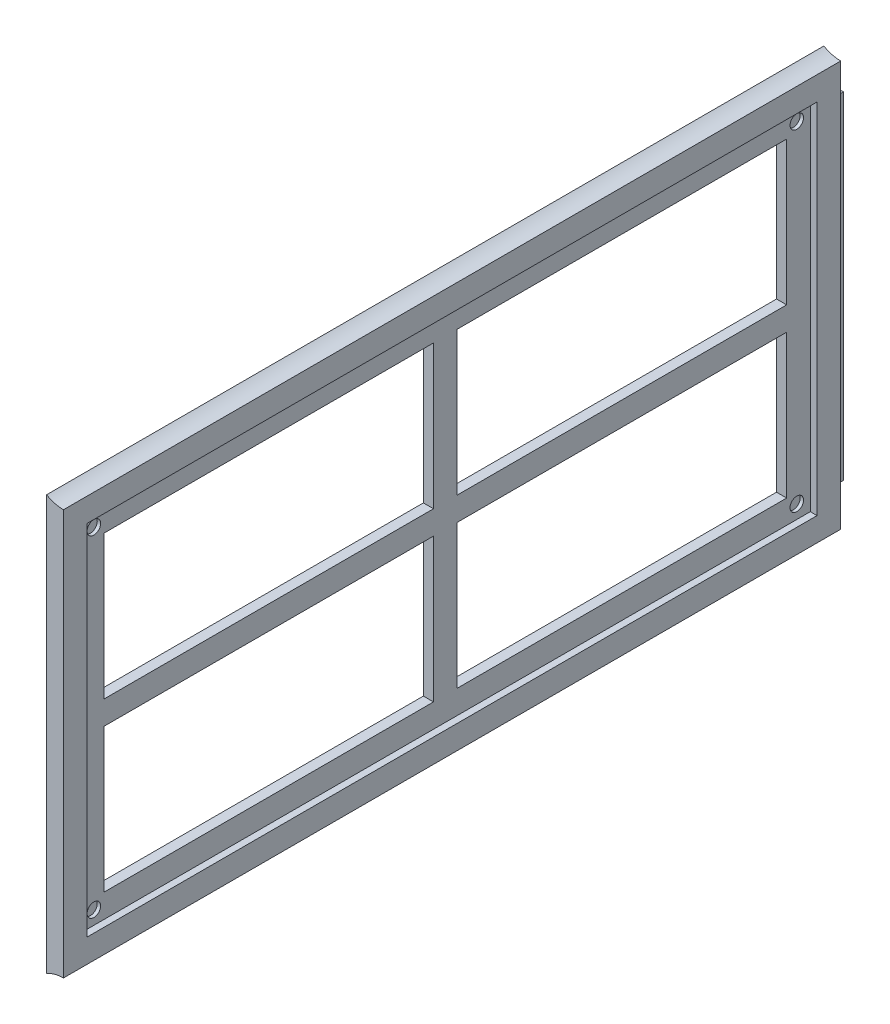
ISO-10303-21;
HEADER;
FILE_DESCRIPTION(('STEP AP214'),'2;1');
FILE_NAME('part.step','',(''),(''),'','','');
FILE_SCHEMA(('AUTOMOTIVE_DESIGN { 1 0 10303 214 1 1 1 1 }'));
ENDSEC;
DATA;
#1=APPLICATION_CONTEXT('core data for automotive mechanical design processes');
#2=APPLICATION_PROTOCOL_DEFINITION('international standard','automotive_design',2000,#1);
#3=PRODUCT_CONTEXT('',#1,'mechanical');
#4=PRODUCT('Part','Part','',(#3));
#5=PRODUCT_RELATED_PRODUCT_CATEGORY('part','',(#4));
#6=PRODUCT_DEFINITION_FORMATION('','',#4);
#7=PRODUCT_DEFINITION_CONTEXT('part definition',#1,'design');
#8=PRODUCT_DEFINITION('design','',#6,#7);
#9=PRODUCT_DEFINITION_SHAPE('','',#8);
#10=(LENGTH_UNIT() NAMED_UNIT(*) SI_UNIT(.MILLI.,.METRE.));
#11=(NAMED_UNIT(*) PLANE_ANGLE_UNIT() SI_UNIT($,.RADIAN.));
#12=(NAMED_UNIT(*) SI_UNIT($,.STERADIAN.) SOLID_ANGLE_UNIT());
#13=UNCERTAINTY_MEASURE_WITH_UNIT(LENGTH_MEASURE(1.E-05),#10,'distance_accuracy_value','');
#14=(GEOMETRIC_REPRESENTATION_CONTEXT(3) GLOBAL_UNCERTAINTY_ASSIGNED_CONTEXT((#13)) GLOBAL_UNIT_ASSIGNED_CONTEXT((#10,
#11,#12)) REPRESENTATION_CONTEXT('',''));
#15=CARTESIAN_POINT('',(0.,0.,0.));
#16=DIRECTION('',(0.,0.,1.));
#17=DIRECTION('',(1.,0.,0.));
#18=AXIS2_PLACEMENT_3D('',#15,#16,#17);
#19=CARTESIAN_POINT('',(-227.7,46.0020002000401,216.));
#20=DIRECTION('',(0.,0.,1.));
#21=DIRECTION('',(1.,0.,0.));
#22=AXIS2_PLACEMENT_3D('',#19,#20,#21);
#23=PLANE('',#22);
#24=DIRECTION('',(0.,1.,0.));
#25=VECTOR('',#24,1.);
#26=CARTESIAN_POINT('',(0.299999999999967,46.00200020004,216.));
#27=LINE('',#26,#25);
#28=CARTESIAN_POINT('',(0.299999999999967,3.50000000000001,216.));
#29=VERTEX_POINT('',#28);
#30=CARTESIAN_POINT('',(0.299999999999967,46.00200020004,216.));
#31=VERTEX_POINT('',#30);
#32=EDGE_CURVE('E326',#29,#31,#27,.T.);
#33=ORIENTED_EDGE('',*,*,#32,.F.);
#34=DIRECTION('',(1.,0.,0.));
#35=VECTOR('',#34,1.);
#36=CARTESIAN_POINT('',(-227.7,3.50000000000006,216.));
#37=LINE('',#36,#35);
#38=CARTESIAN_POINT('',(-2.70000000000004,3.50000000000001,216.));
#39=VERTEX_POINT('',#38);
#40=EDGE_CURVE('E350',#39,#29,#37,.T.);
#41=ORIENTED_EDGE('',*,*,#40,.F.);
#42=DIRECTION('',(0.,-1.,0.));
#43=VECTOR('',#42,1.);
#44=CARTESIAN_POINT('',(-2.70000000000003,-61.3397459621557,216.));
#45=LINE('',#44,#43);
#46=CARTESIAN_POINT('',(-2.70000000000004,46.0020002000401,216.));
#47=VERTEX_POINT('',#46);
#48=EDGE_CURVE('E405',#47,#39,#45,.T.);
#49=ORIENTED_EDGE('',*,*,#48,.F.);
#50=DIRECTION('',(1.,0.,0.));
#51=VECTOR('',#50,1.);
#52=CARTESIAN_POINT('',(-227.7,46.0020002000401,216.));
#53=LINE('',#52,#51);
#54=EDGE_CURVE('E378',#47,#31,#53,.T.);
#55=ORIENTED_EDGE('',*,*,#54,.T.);
#56=EDGE_LOOP('',(#33,#41,#49,#55));
#57=FACE_BOUND('',#56,.T.);
#58=ADVANCED_FACE('F45',(#57),#23,.F.);
#59=CARTESIAN_POINT('',(-227.7,46.0020002000401,216.));
#60=DIRECTION('',(0.,1.,0.));
#61=DIRECTION('',(-1.,0.,0.));
#62=AXIS2_PLACEMENT_3D('',#59,#60,#61);
#63=PLANE('',#62);
#64=DIRECTION('',(0.,0.,-1.));
#65=VECTOR('',#64,1.);
#66=CARTESIAN_POINT('',(0.299999999999967,46.00200020004,216.));
#67=LINE('',#66,#65);
#68=CARTESIAN_POINT('',(0.299999999999967,46.0020002000401,118.5));
#69=VERTEX_POINT('',#68);
#70=EDGE_CURVE('E323',#31,#69,#67,.T.);
#71=ORIENTED_EDGE('',*,*,#70,.F.);
#72=ORIENTED_EDGE('',*,*,#54,.F.);
#73=DIRECTION('',(0.,0.,1.));
#74=VECTOR('',#73,1.);
#75=CARTESIAN_POINT('',(-2.70000000000003,46.00200020004,230.));
#76=LINE('',#75,#74);
#77=CARTESIAN_POINT('',(-2.70000000000004,46.0020002000401,118.5));
#78=VERTEX_POINT('',#77);
#79=EDGE_CURVE('E401',#78,#47,#76,.T.);
#80=ORIENTED_EDGE('',*,*,#79,.F.);
#81=DIRECTION('',(1.,0.,0.));
#82=VECTOR('',#81,1.);
#83=CARTESIAN_POINT('',(-227.7,46.0020002000401,118.5));
#84=LINE('',#83,#82);
#85=EDGE_CURVE('E383',#78,#69,#84,.T.);
#86=ORIENTED_EDGE('',*,*,#85,.T.);
#87=EDGE_LOOP('',(#71,#72,#80,#86));
#88=FACE_BOUND('',#87,.T.);
#89=ADVANCED_FACE('F579',(#88),#63,.F.);
#90=CARTESIAN_POINT('',(-227.7,46.0020002000401,118.5));
#91=DIRECTION('',(0.,0.,-1.));
#92=DIRECTION('',(-1.,0.,0.));
#93=AXIS2_PLACEMENT_3D('',#90,#91,#92);
#94=PLANE('',#93);
#95=DIRECTION('',(0.,-1.,0.));
#96=VECTOR('',#95,1.);
#97=CARTESIAN_POINT('',(0.299999999999967,46.00200020004,118.5));
#98=LINE('',#97,#96);
#99=CARTESIAN_POINT('',(0.299999999999967,3.50000000000001,118.5));
#100=VERTEX_POINT('',#99);
#101=EDGE_CURVE('E69',#69,#100,#98,.T.);
#102=ORIENTED_EDGE('',*,*,#101,.F.);
#103=ORIENTED_EDGE('',*,*,#85,.F.);
#104=DIRECTION('',(0.,1.,0.));
#105=VECTOR('',#104,1.);
#106=CARTESIAN_POINT('',(-2.70000000000003,-61.3397459621557,118.5));
#107=LINE('',#106,#105);
#108=CARTESIAN_POINT('',(-2.70000000000003,3.5,118.5));
#109=VERTEX_POINT('',#108);
#110=EDGE_CURVE('E397',#109,#78,#107,.T.);
#111=ORIENTED_EDGE('',*,*,#110,.F.);
#112=DIRECTION('',(1.,0.,0.));
#113=VECTOR('',#112,1.);
#114=CARTESIAN_POINT('',(-227.7,3.50000000000006,118.5));
#115=LINE('',#114,#113);
#116=EDGE_CURVE('E387',#109,#100,#115,.T.);
#117=ORIENTED_EDGE('',*,*,#116,.T.);
#118=EDGE_LOOP('',(#102,#103,#111,#117));
#119=FACE_BOUND('',#118,.T.);
#120=ADVANCED_FACE('F586',(#119),#94,.F.);
#121=CARTESIAN_POINT('',(-227.7,3.50000000000006,216.));
#122=DIRECTION('',(0.,-1.,0.));
#123=DIRECTION('',(1.,0.,0.));
#124=AXIS2_PLACEMENT_3D('',#121,#122,#123);
#125=PLANE('',#124);
#126=DIRECTION('',(0.,0.,1.));
#127=VECTOR('',#126,1.);
#128=CARTESIAN_POINT('',(0.299999999999967,3.50000000000001,216.));
#129=LINE('',#128,#127);
#130=EDGE_CURVE('E318',#100,#29,#129,.T.);
#131=ORIENTED_EDGE('',*,*,#130,.F.);
#132=ORIENTED_EDGE('',*,*,#116,.F.);
#133=DIRECTION('',(0.,0.,-1.));
#134=VECTOR('',#133,1.);
#135=CARTESIAN_POINT('',(-2.70000000000003,3.5,230.));
#136=LINE('',#135,#134);
#137=EDGE_CURVE('E382',#39,#109,#136,.T.);
#138=ORIENTED_EDGE('',*,*,#137,.F.);
#139=ORIENTED_EDGE('',*,*,#40,.T.);
#140=EDGE_LOOP('',(#131,#132,#138,#139));
#141=FACE_BOUND('',#140,.T.);
#142=ADVANCED_FACE('F592',(#141),#125,.F.);
#143=CARTESIAN_POINT('',(-227.7,-3.49999999999994,14.));
#144=DIRECTION('',(0.,0.,-1.));
#145=DIRECTION('',(0.,1.,0.));
#146=AXIS2_PLACEMENT_3D('',#143,#144,#145);
#147=PLANE('',#146);
#148=DIRECTION('',(0.,-1.,0.));
#149=VECTOR('',#148,1.);
#150=CARTESIAN_POINT('',(0.299999999999967,-3.49999999999999,14.));
#151=LINE('',#150,#149);
#152=CARTESIAN_POINT('',(0.299999999999967,-3.49999999999999,14.));
#153=VERTEX_POINT('',#152);
#154=CARTESIAN_POINT('',(0.299999999999967,-46.00200020004,14.));
#155=VERTEX_POINT('',#154);
#156=EDGE_CURVE('E315',#153,#155,#151,.T.);
#157=ORIENTED_EDGE('',*,*,#156,.F.);
#158=DIRECTION('',(1.,0.,0.));
#159=VECTOR('',#158,1.);
#160=CARTESIAN_POINT('',(-227.7,-3.49999999999994,14.));
#161=LINE('',#160,#159);
#162=CARTESIAN_POINT('',(-2.70000000000004,-3.49999999999999,14.));
#163=VERTEX_POINT('',#162);
#164=EDGE_CURVE('E330',#163,#153,#161,.T.);
#165=ORIENTED_EDGE('',*,*,#164,.F.);
#166=DIRECTION('',(0.,1.,0.));
#167=VECTOR('',#166,1.);
#168=CARTESIAN_POINT('',(-2.70000000000003,-61.3397459621556,14.));
#169=LINE('',#168,#167);
#170=CARTESIAN_POINT('',(-2.70000000000004,-46.00200020004,14.));
#171=VERTEX_POINT('',#170);
#172=EDGE_CURVE('E421',#171,#163,#169,.T.);
#173=ORIENTED_EDGE('',*,*,#172,.F.);
#174=DIRECTION('',(1.,0.,0.));
#175=VECTOR('',#174,1.);
#176=CARTESIAN_POINT('',(-227.7,-46.00200020004,14.));
#177=LINE('',#176,#175);
#178=EDGE_CURVE('E329',#171,#155,#177,.T.);
#179=ORIENTED_EDGE('',*,*,#178,.T.);
#180=EDGE_LOOP('',(#157,#165,#173,#179));
#181=FACE_BOUND('',#180,.T.);
#182=ADVANCED_FACE('F784',(#181),#147,.F.);
#183=CARTESIAN_POINT('',(-227.7,-46.00200020004,14.));
#184=DIRECTION('',(0.,-1.,0.));
#185=DIRECTION('',(1.,0.,0.));
#186=AXIS2_PLACEMENT_3D('',#183,#184,#185);
#187=PLANE('',#186);
#188=DIRECTION('',(0.,0.,1.));
#189=VECTOR('',#188,1.);
#190=CARTESIAN_POINT('',(0.299999999999967,-46.00200020004,14.));
#191=LINE('',#190,#189);
#192=CARTESIAN_POINT('',(0.299999999999957,-46.00200020004,111.5));
#193=VERTEX_POINT('',#192);
#194=EDGE_CURVE('E312',#155,#193,#191,.T.);
#195=ORIENTED_EDGE('',*,*,#194,.F.);
#196=ORIENTED_EDGE('',*,*,#178,.F.);
#197=DIRECTION('',(0.,0.,-1.));
#198=VECTOR('',#197,1.);
#199=CARTESIAN_POINT('',(-2.70000000000003,-46.00200020004,230.));
#200=LINE('',#199,#198);
#201=CARTESIAN_POINT('',(-2.70000000000004,-46.00200020004,111.5));
#202=VERTEX_POINT('',#201);
#203=EDGE_CURVE('E417',#202,#171,#200,.T.);
#204=ORIENTED_EDGE('',*,*,#203,.F.);
#205=DIRECTION('',(1.,0.,0.));
#206=VECTOR('',#205,1.);
#207=CARTESIAN_POINT('',(-227.7,-46.00200020004,111.5));
#208=LINE('',#207,#206);
#209=EDGE_CURVE('E339',#202,#193,#208,.T.);
#210=ORIENTED_EDGE('',*,*,#209,.T.);
#211=EDGE_LOOP('',(#195,#196,#204,#210));
#212=FACE_BOUND('',#211,.T.);
#213=ADVANCED_FACE('F774',(#212),#187,.F.);
#214=CARTESIAN_POINT('',(-227.7,-3.49999999999994,111.5));
#215=DIRECTION('',(0.,0.,1.));
#216=DIRECTION('',(0.,-1.,0.));
#217=AXIS2_PLACEMENT_3D('',#214,#215,#216);
#218=PLANE('',#217);
#219=DIRECTION('',(0.,1.,0.));
#220=VECTOR('',#219,1.);
#221=CARTESIAN_POINT('',(0.299999999999967,-3.49999999999999,111.5));
#222=LINE('',#221,#220);
#223=CARTESIAN_POINT('',(0.299999999999967,-3.49999999999999,111.5));
#224=VERTEX_POINT('',#223);
#225=EDGE_CURVE('E309',#193,#224,#222,.T.);
#226=ORIENTED_EDGE('',*,*,#225,.F.);
#227=ORIENTED_EDGE('',*,*,#209,.F.);
#228=DIRECTION('',(0.,-1.,0.));
#229=VECTOR('',#228,1.);
#230=CARTESIAN_POINT('',(-2.70000000000003,-61.3397459621555,111.5));
#231=LINE('',#230,#229);
#232=CARTESIAN_POINT('',(-2.70000000000003,-3.49999999999999,111.5));
#233=VERTEX_POINT('',#232);
#234=EDGE_CURVE('E413',#233,#202,#231,.T.);
#235=ORIENTED_EDGE('',*,*,#234,.F.);
#236=DIRECTION('',(1.,0.,0.));
#237=VECTOR('',#236,1.);
#238=CARTESIAN_POINT('',(-227.7,-3.49999999999994,111.5));
#239=LINE('',#238,#237);
#240=EDGE_CURVE('E335',#233,#224,#239,.T.);
#241=ORIENTED_EDGE('',*,*,#240,.T.);
#242=EDGE_LOOP('',(#226,#227,#235,#241));
#243=FACE_BOUND('',#242,.T.);
#244=ADVANCED_FACE('F764',(#243),#218,.F.);
#245=CARTESIAN_POINT('',(-227.7,-3.49999999999994,14.));
#246=DIRECTION('',(0.,1.,0.));
#247=DIRECTION('',(-1.,0.,0.));
#248=AXIS2_PLACEMENT_3D('',#245,#246,#247);
#249=PLANE('',#248);
#250=DIRECTION('',(0.,0.,-1.));
#251=VECTOR('',#250,1.);
#252=CARTESIAN_POINT('',(0.299999999999967,-3.49999999999999,14.));
#253=LINE('',#252,#251);
#254=EDGE_CURVE('E306',#224,#153,#253,.T.);
#255=ORIENTED_EDGE('',*,*,#254,.F.);
#256=ORIENTED_EDGE('',*,*,#240,.F.);
#257=DIRECTION('',(0.,0.,1.));
#258=VECTOR('',#257,1.);
#259=CARTESIAN_POINT('',(-2.70000000000003,-3.49999999999999,230.));
#260=LINE('',#259,#258);
#261=EDGE_CURVE('E409',#163,#233,#260,.T.);
#262=ORIENTED_EDGE('',*,*,#261,.F.);
#263=ORIENTED_EDGE('',*,*,#164,.T.);
#264=EDGE_LOOP('',(#255,#256,#262,#263));
#265=FACE_BOUND('',#264,.T.);
#266=ADVANCED_FACE('F754',(#265),#249,.F.);
#267=CARTESIAN_POINT('',(-227.7,-3.49999999999994,216.));
#268=DIRECTION('',(0.,0.,1.));
#269=DIRECTION('',(1.,0.,0.));
#270=AXIS2_PLACEMENT_3D('',#267,#268,#269);
#271=PLANE('',#270);
#272=DIRECTION('',(0.,1.,0.));
#273=VECTOR('',#272,1.);
#274=CARTESIAN_POINT('',(0.299999999999967,-3.49999999999999,216.));
#275=LINE('',#274,#273);
#276=CARTESIAN_POINT('',(0.299999999999967,-46.00200020004,216.));
#277=VERTEX_POINT('',#276);
#278=CARTESIAN_POINT('',(0.299999999999967,-3.49999999999999,216.));
#279=VERTEX_POINT('',#278);
#280=EDGE_CURVE('E303',#277,#279,#275,.T.);
#281=ORIENTED_EDGE('',*,*,#280,.F.);
#282=DIRECTION('',(1.,0.,0.));
#283=VECTOR('',#282,1.);
#284=CARTESIAN_POINT('',(-227.7,-46.0020002000399,216.));
#285=LINE('',#284,#283);
#286=CARTESIAN_POINT('',(-2.70000000000004,-46.00200020004,216.));
#287=VERTEX_POINT('',#286);
#288=EDGE_CURVE('E363',#287,#277,#285,.T.);
#289=ORIENTED_EDGE('',*,*,#288,.F.);
#290=DIRECTION('',(0.,-1.,0.));
#291=VECTOR('',#290,1.);
#292=CARTESIAN_POINT('',(-2.70000000000003,-61.3397459621557,216.));
#293=LINE('',#292,#291);
#294=CARTESIAN_POINT('',(-2.70000000000004,-3.49999999999999,216.));
#295=VERTEX_POINT('',#294);
#296=EDGE_CURVE('E437',#295,#287,#293,.T.);
#297=ORIENTED_EDGE('',*,*,#296,.F.);
#298=DIRECTION('',(1.,0.,0.));
#299=VECTOR('',#298,1.);
#300=CARTESIAN_POINT('',(-227.7,-3.49999999999994,216.));
#301=LINE('',#300,#299);
#302=EDGE_CURVE('E334',#295,#279,#301,.T.);
#303=ORIENTED_EDGE('',*,*,#302,.T.);
#304=EDGE_LOOP('',(#281,#289,#297,#303));
#305=FACE_BOUND('',#304,.T.);
#306=ADVANCED_FACE('F744',(#305),#271,.F.);
#307=CARTESIAN_POINT('',(-227.7,-3.49999999999994,216.));
#308=DIRECTION('',(0.,1.,0.));
#309=DIRECTION('',(-1.,0.,0.));
#310=AXIS2_PLACEMENT_3D('',#307,#308,#309);
#311=PLANE('',#310);
#312=DIRECTION('',(0.,0.,-1.));
#313=VECTOR('',#312,1.);
#314=CARTESIAN_POINT('',(0.299999999999967,-3.49999999999999,216.));
#315=LINE('',#314,#313);
#316=CARTESIAN_POINT('',(0.299999999999967,-3.49999999999999,118.5));
#317=VERTEX_POINT('',#316);
#318=EDGE_CURVE('E300',#279,#317,#315,.T.);
#319=ORIENTED_EDGE('',*,*,#318,.F.);
#320=ORIENTED_EDGE('',*,*,#302,.F.);
#321=DIRECTION('',(0.,0.,1.));
#322=VECTOR('',#321,1.);
#323=CARTESIAN_POINT('',(-2.70000000000003,-3.49999999999999,230.));
#324=LINE('',#323,#322);
#325=CARTESIAN_POINT('',(-2.70000000000004,-3.49999999999999,118.5));
#326=VERTEX_POINT('',#325);
#327=EDGE_CURVE('E433',#326,#295,#324,.T.);
#328=ORIENTED_EDGE('',*,*,#327,.F.);
#329=DIRECTION('',(1.,0.,0.));
#330=VECTOR('',#329,1.);
#331=CARTESIAN_POINT('',(-227.7,-3.49999999999994,118.5));
#332=LINE('',#331,#330);
#333=EDGE_CURVE('E371',#326,#317,#332,.T.);
#334=ORIENTED_EDGE('',*,*,#333,.T.);
#335=EDGE_LOOP('',(#319,#320,#328,#334));
#336=FACE_BOUND('',#335,.T.);
#337=ADVANCED_FACE('F734',(#336),#311,.F.);
#338=CARTESIAN_POINT('',(-227.7,-3.49999999999994,118.5));
#339=DIRECTION('',(0.,0.,-1.));
#340=DIRECTION('',(0.,1.,0.));
#341=AXIS2_PLACEMENT_3D('',#338,#339,#340);
#342=PLANE('',#341);
#343=DIRECTION('',(0.,-1.,0.));
#344=VECTOR('',#343,1.);
#345=CARTESIAN_POINT('',(0.299999999999967,-3.49999999999999,118.5));
#346=LINE('',#345,#344);
#347=CARTESIAN_POINT('',(0.299999999999967,-46.00200020004,118.5));
#348=VERTEX_POINT('',#347);
#349=EDGE_CURVE('E297',#317,#348,#346,.T.);
#350=ORIENTED_EDGE('',*,*,#349,.F.);
#351=ORIENTED_EDGE('',*,*,#333,.F.);
#352=DIRECTION('',(0.,1.,0.));
#353=VECTOR('',#352,1.);
#354=CARTESIAN_POINT('',(-2.70000000000003,-61.3397459621556,118.5));
#355=LINE('',#354,#353);
#356=CARTESIAN_POINT('',(-2.70000000000003,-46.00200020004,118.5));
#357=VERTEX_POINT('',#356);
#358=EDGE_CURVE('E429',#357,#326,#355,.T.);
#359=ORIENTED_EDGE('',*,*,#358,.F.);
#360=DIRECTION('',(1.,0.,0.));
#361=VECTOR('',#360,1.);
#362=CARTESIAN_POINT('',(-227.7,-46.0020002000399,118.5));
#363=LINE('',#362,#361);
#364=EDGE_CURVE('E367',#357,#348,#363,.T.);
#365=ORIENTED_EDGE('',*,*,#364,.T.);
#366=EDGE_LOOP('',(#350,#351,#359,#365));
#367=FACE_BOUND('',#366,.T.);
#368=ADVANCED_FACE('F724',(#367),#342,.F.);
#369=CARTESIAN_POINT('',(-227.7,-46.0020002000399,216.));
#370=DIRECTION('',(0.,-1.,0.));
#371=DIRECTION('',(1.,0.,0.));
#372=AXIS2_PLACEMENT_3D('',#369,#370,#371);
#373=PLANE('',#372);
#374=DIRECTION('',(0.,0.,1.));
#375=VECTOR('',#374,1.);
#376=CARTESIAN_POINT('',(0.299999999999967,-46.00200020004,216.));
#377=LINE('',#376,#375);
#378=EDGE_CURVE('E294',#348,#277,#377,.T.);
#379=ORIENTED_EDGE('',*,*,#378,.F.);
#380=ORIENTED_EDGE('',*,*,#364,.F.);
#381=DIRECTION('',(0.,0.,-1.));
#382=VECTOR('',#381,1.);
#383=CARTESIAN_POINT('',(-2.70000000000003,-46.00200020004,230.));
#384=LINE('',#383,#382);
#385=EDGE_CURVE('E425',#287,#357,#384,.T.);
#386=ORIENTED_EDGE('',*,*,#385,.F.);
#387=ORIENTED_EDGE('',*,*,#288,.T.);
#388=EDGE_LOOP('',(#379,#380,#386,#387));
#389=FACE_BOUND('',#388,.T.);
#390=ADVANCED_FACE('F714',(#389),#373,.F.);
#391=CARTESIAN_POINT('',(-227.7,46.0020002000402,111.5));
#392=DIRECTION('',(0.,0.,1.));
#393=DIRECTION('',(0.,-1.,0.));
#394=AXIS2_PLACEMENT_3D('',#391,#392,#393);
#395=PLANE('',#394);
#396=DIRECTION('',(0.,1.,0.));
#397=VECTOR('',#396,1.);
#398=CARTESIAN_POINT('',(0.299999999999967,46.0020002000401,111.5));
#399=LINE('',#398,#397);
#400=CARTESIAN_POINT('',(0.299999999999967,3.50000000000001,111.5));
#401=VERTEX_POINT('',#400);
#402=CARTESIAN_POINT('',(0.299999999999967,46.0020002000401,111.5));
#403=VERTEX_POINT('',#402);
#404=EDGE_CURVE('E291',#401,#403,#399,.T.);
#405=ORIENTED_EDGE('',*,*,#404,.F.);
#406=DIRECTION('',(1.,0.,0.));
#407=VECTOR('',#406,1.);
#408=CARTESIAN_POINT('',(-227.7,3.50000000000006,111.5));
#409=LINE('',#408,#407);
#410=CARTESIAN_POINT('',(-2.70000000000004,3.50000000000001,111.5));
#411=VERTEX_POINT('',#410);
#412=EDGE_CURVE('E346',#411,#401,#409,.T.);
#413=ORIENTED_EDGE('',*,*,#412,.F.);
#414=DIRECTION('',(0.,-1.,0.));
#415=VECTOR('',#414,1.);
#416=CARTESIAN_POINT('',(-2.70000000000003,-61.3397459621557,111.5));
#417=LINE('',#416,#415);
#418=CARTESIAN_POINT('',(-2.70000000000004,46.0020002000401,111.5));
#419=VERTEX_POINT('',#418);
#420=EDGE_CURVE('E453',#419,#411,#417,.T.);
#421=ORIENTED_EDGE('',*,*,#420,.F.);
#422=DIRECTION('',(1.,0.,0.));
#423=VECTOR('',#422,1.);
#424=CARTESIAN_POINT('',(-227.7,46.0020002000402,111.5));
#425=LINE('',#424,#423);
#426=EDGE_CURVE('E359',#419,#403,#425,.T.);
#427=ORIENTED_EDGE('',*,*,#426,.T.);
#428=EDGE_LOOP('',(#405,#413,#421,#427));
#429=FACE_BOUND('',#428,.T.);
#430=ADVANCED_FACE('F704',(#429),#395,.F.);
#431=CARTESIAN_POINT('',(-227.7,46.0020002000402,111.5));
#432=DIRECTION('',(0.,1.,0.));
#433=DIRECTION('',(-1.,0.,0.));
#434=AXIS2_PLACEMENT_3D('',#431,#432,#433);
#435=PLANE('',#434);
#436=DIRECTION('',(0.,0.,-1.));
#437=VECTOR('',#436,1.);
#438=CARTESIAN_POINT('',(0.299999999999967,46.0020002000401,111.5));
#439=LINE('',#438,#437);
#440=CARTESIAN_POINT('',(0.299999999999967,46.0020002000401,14.));
#441=VERTEX_POINT('',#440);
#442=EDGE_CURVE('E288',#403,#441,#439,.T.);
#443=ORIENTED_EDGE('',*,*,#442,.F.);
#444=ORIENTED_EDGE('',*,*,#426,.F.);
#445=DIRECTION('',(0.,0.,1.));
#446=VECTOR('',#445,1.);
#447=CARTESIAN_POINT('',(-2.70000000000003,46.0020002000401,230.));
#448=LINE('',#447,#446);
#449=CARTESIAN_POINT('',(-2.70000000000004,46.0020002000401,14.));
#450=VERTEX_POINT('',#449);
#451=EDGE_CURVE('E449',#450,#419,#448,.T.);
#452=ORIENTED_EDGE('',*,*,#451,.F.);
#453=DIRECTION('',(1.,0.,0.));
#454=VECTOR('',#453,1.);
#455=CARTESIAN_POINT('',(-227.7,46.0020002000402,14.));
#456=LINE('',#455,#454);
#457=EDGE_CURVE('E355',#450,#441,#456,.T.);
#458=ORIENTED_EDGE('',*,*,#457,.T.);
#459=EDGE_LOOP('',(#443,#444,#452,#458));
#460=FACE_BOUND('',#459,.T.);
#461=ADVANCED_FACE('F694',(#460),#435,.F.);
#462=CARTESIAN_POINT('',(-227.7,46.0020002000402,14.));
#463=DIRECTION('',(0.,0.,-1.));
#464=DIRECTION('',(0.,1.,0.));
#465=AXIS2_PLACEMENT_3D('',#462,#463,#464);
#466=PLANE('',#465);
#467=DIRECTION('',(0.,-1.,0.));
#468=VECTOR('',#467,1.);
#469=CARTESIAN_POINT('',(0.299999999999967,46.0020002000401,14.));
#470=LINE('',#469,#468);
#471=CARTESIAN_POINT('',(0.299999999999967,3.50000000000001,14.));
#472=VERTEX_POINT('',#471);
#473=EDGE_CURVE('E280',#441,#472,#470,.T.);
#474=ORIENTED_EDGE('',*,*,#473,.F.);
#475=ORIENTED_EDGE('',*,*,#457,.F.);
#476=DIRECTION('',(0.,1.,0.));
#477=VECTOR('',#476,1.);
#478=CARTESIAN_POINT('',(-2.70000000000003,-61.3397459621556,14.));
#479=LINE('',#478,#477);
#480=CARTESIAN_POINT('',(-2.70000000000003,3.5,14.));
#481=VERTEX_POINT('',#480);
#482=EDGE_CURVE('E445',#481,#450,#479,.T.);
#483=ORIENTED_EDGE('',*,*,#482,.F.);
#484=DIRECTION('',(1.,0.,0.));
#485=VECTOR('',#484,1.);
#486=CARTESIAN_POINT('',(-227.7,3.50000000000006,14.));
#487=LINE('',#486,#485);
#488=EDGE_CURVE('E351',#481,#472,#487,.T.);
#489=ORIENTED_EDGE('',*,*,#488,.T.);
#490=EDGE_LOOP('',(#474,#475,#483,#489));
#491=FACE_BOUND('',#490,.T.);
#492=ADVANCED_FACE('F574',(#491),#466,.F.);
#493=CARTESIAN_POINT('',(-227.7,3.50000000000006,111.5));
#494=DIRECTION('',(0.,-1.,0.));
#495=DIRECTION('',(1.,0.,0.));
#496=AXIS2_PLACEMENT_3D('',#493,#494,#495);
#497=PLANE('',#496);
#498=DIRECTION('',(0.,0.,1.));
#499=VECTOR('',#498,1.);
#500=CARTESIAN_POINT('',(0.299999999999967,3.50000000000001,111.5));
#501=LINE('',#500,#499);
#502=EDGE_CURVE('E11',#472,#401,#501,.T.);
#503=ORIENTED_EDGE('',*,*,#502,.F.);
#504=ORIENTED_EDGE('',*,*,#488,.F.);
#505=DIRECTION('',(0.,0.,-1.));
#506=VECTOR('',#505,1.);
#507=CARTESIAN_POINT('',(-2.70000000000003,3.5,230.));
#508=LINE('',#507,#506);
#509=EDGE_CURVE('E441',#411,#481,#508,.T.);
#510=ORIENTED_EDGE('',*,*,#509,.F.);
#511=ORIENTED_EDGE('',*,*,#412,.T.);
#512=EDGE_LOOP('',(#503,#504,#510,#511));
#513=FACE_BOUND('',#512,.T.);
#514=ADVANCED_FACE('F566',(#513),#497,.F.);
#515=CARTESIAN_POINT('',(2.29653499121186,70.0019995997259,230.));
#516=DIRECTION('',(0.,0.,1.));
#517=DIRECTION('',(1.,0.,0.));
#518=AXIS2_PLACEMENT_3D('',#515,#516,#517);
#519=PLANE('',#518);
#520=CARTESIAN_POINT('',(2.29653499121186,70.0019995997259,230.));
#521=DIRECTION('',(0.,0.,-1.));
#522=DIRECTION('',(1.,0.,0.));
#523=AXIS2_PLACEMENT_3D('',#520,#521,#522);
#524=CIRCLE('',#523,10.0000000000001);
#525=CARTESIAN_POINT('',(2.29999999999997,60.00200020004,230.));
#526=VERTEX_POINT('',#525);
#527=CARTESIAN_POINT('',(-2.70000000000003,61.3397459621557,230.));
#528=VERTEX_POINT('',#527);
#529=EDGE_CURVE('E505',#526,#528,#524,.T.);
#530=ORIENTED_EDGE('',*,*,#529,.T.);
#531=DIRECTION('',(0.,-1.,0.));
#532=VECTOR('',#531,1.);
#533=CARTESIAN_POINT('',(-2.70000000000003,-61.3397459621557,230.));
#534=LINE('',#533,#532);
#535=CARTESIAN_POINT('',(-2.70000000000003,-61.3397459621557,230.));
#536=VERTEX_POINT('',#535);
#537=EDGE_CURVE('E509',#528,#536,#534,.T.);
#538=ORIENTED_EDGE('',*,*,#537,.T.);
#539=CARTESIAN_POINT('',(2.29653499121182,-70.0019995997256,230.));
#540=DIRECTION('',(0.,0.,-1.));
#541=DIRECTION('',(-1.,0.,0.));
#542=AXIS2_PLACEMENT_3D('',#539,#540,#541);
#543=CIRCLE('',#542,9.99999999999993);
#544=CARTESIAN_POINT('',(2.29999999999998,-60.00200020004,230.));
#545=VERTEX_POINT('',#544);
#546=EDGE_CURVE('E513',#536,#545,#543,.T.);
#547=ORIENTED_EDGE('',*,*,#546,.T.);
#548=DIRECTION('',(0.,1.,0.));
#549=VECTOR('',#548,1.);
#550=CARTESIAN_POINT('',(2.29999999999997,60.00200020004,230.));
#551=LINE('',#550,#549);
#552=EDGE_CURVE('E516',#545,#526,#551,.T.);
#553=ORIENTED_EDGE('',*,*,#552,.T.);
#554=EDGE_LOOP('',(#530,#538,#547,#553));
#555=FACE_BOUND('',#554,.T.);
#556=ADVANCED_FACE('F564',(#555),#519,.T.);
#557=CARTESIAN_POINT('',(2.29653499121186,70.0019995997259,0.));
#558=DIRECTION('',(0.,0.,1.));
#559=DIRECTION('',(1.,0.,0.));
#560=AXIS2_PLACEMENT_3D('',#557,#558,#559);
#561=PLANE('',#560);
#562=CARTESIAN_POINT('',(2.29653499121186,70.0019995997259,0.));
#563=DIRECTION('',(0.,0.,-1.));
#564=DIRECTION('',(1.,0.,0.));
#565=AXIS2_PLACEMENT_3D('',#562,#563,#564);
#566=CIRCLE('',#565,10.0000000000001);
#567=CARTESIAN_POINT('',(2.29999999999997,60.00200020004,0.));
#568=VERTEX_POINT('',#567);
#569=CARTESIAN_POINT('',(-2.70000000000003,61.3397459621557,0.));
#570=VERTEX_POINT('',#569);
#571=EDGE_CURVE('E504',#568,#570,#566,.T.);
#572=ORIENTED_EDGE('',*,*,#571,.F.);
#573=DIRECTION('',(0.,1.,0.));
#574=VECTOR('',#573,1.);
#575=CARTESIAN_POINT('',(2.29999999999997,60.00200020004,0.));
#576=LINE('',#575,#574);
#577=CARTESIAN_POINT('',(2.29999999999998,-60.00200020004,0.));
#578=VERTEX_POINT('',#577);
#579=EDGE_CURVE('E510',#578,#568,#576,.T.);
#580=ORIENTED_EDGE('',*,*,#579,.F.);
#581=CARTESIAN_POINT('',(2.29653499121182,-70.0019995997256,0.));
#582=DIRECTION('',(0.,0.,-1.));
#583=DIRECTION('',(-1.,0.,0.));
#584=AXIS2_PLACEMENT_3D('',#581,#582,#583);
#585=CIRCLE('',#584,9.99999999999993);
#586=CARTESIAN_POINT('',(-2.70000000000003,-61.3397459621557,0.));
#587=VERTEX_POINT('',#586);
#588=EDGE_CURVE('E526',#587,#578,#585,.T.);
#589=ORIENTED_EDGE('',*,*,#588,.F.);
#590=DIRECTION('',(0.,-1.,0.));
#591=VECTOR('',#590,1.);
#592=CARTESIAN_POINT('',(-2.70000000000003,-61.3397459621557,0.));
#593=LINE('',#592,#591);
#594=EDGE_CURVE('E523',#570,#587,#593,.T.);
#595=ORIENTED_EDGE('',*,*,#594,.F.);
#596=EDGE_LOOP('',(#572,#580,#589,#595));
#597=FACE_BOUND('',#596,.T.);
#598=DIRECTION('',(0.,-1.,0.));
#599=VECTOR('',#598,1.);
#600=CARTESIAN_POINT('',(-1.00000000000003,50.,0.));
#601=LINE('',#600,#599);
#602=CARTESIAN_POINT('',(-1.00000000000003,50.,0.));
#603=VERTEX_POINT('',#602);
#604=CARTESIAN_POINT('',(-1.00000000000002,-49.6,0.));
#605=VERTEX_POINT('',#604);
#606=EDGE_CURVE('E478',#603,#605,#601,.T.);
#607=ORIENTED_EDGE('',*,*,#606,.T.);
#608=DIRECTION('',(1.,0.,0.));
#609=VECTOR('',#608,1.);
#610=CARTESIAN_POINT('',(-1.00000000000003,-49.6,0.));
#611=LINE('',#610,#609);
#612=CARTESIAN_POINT('',(0.599999999999972,-49.6,0.));
#613=VERTEX_POINT('',#612);
#614=EDGE_CURVE('E492',#605,#613,#611,.T.);
#615=ORIENTED_EDGE('',*,*,#614,.T.);
#616=DIRECTION('',(0.,1.,0.));
#617=VECTOR('',#616,1.);
#618=CARTESIAN_POINT('',(0.599999999999959,50.,0.));
#619=LINE('',#618,#617);
#620=CARTESIAN_POINT('',(0.599999999999959,50.,0.));
#621=VERTEX_POINT('',#620);
#622=EDGE_CURVE('E496',#613,#621,#619,.T.);
#623=ORIENTED_EDGE('',*,*,#622,.T.);
#624=DIRECTION('',(-1.,0.,0.));
#625=VECTOR('',#624,1.);
#626=CARTESIAN_POINT('',(-1.00000000000003,50.,0.));
#627=LINE('',#626,#625);
#628=EDGE_CURVE('E500',#621,#603,#627,.T.);
#629=ORIENTED_EDGE('',*,*,#628,.T.);
#630=EDGE_LOOP('',(#607,#615,#623,#629));
#631=FACE_BOUND('',#630,.T.);
#632=ADVANCED_FACE('F553',(#597,#631),#561,.F.);
#633=CARTESIAN_POINT('',(2.29653499121186,70.0019995997259,230.));
#634=DIRECTION('',(0.,0.,-1.));
#635=DIRECTION('',(-1.,0.,0.));
#636=AXIS2_PLACEMENT_3D('',#633,#634,#635);
#637=CYLINDRICAL_SURFACE('',#636,10.0000000000001);
#638=ORIENTED_EDGE('',*,*,#571,.T.);
#639=DIRECTION('',(0.,0.,-1.));
#640=VECTOR('',#639,1.);
#641=CARTESIAN_POINT('',(-2.70000000000003,61.3397459621557,230.));
#642=LINE('',#641,#640);
#643=EDGE_CURVE('E54',#528,#570,#642,.T.);
#644=ORIENTED_EDGE('',*,*,#643,.F.);
#645=ORIENTED_EDGE('',*,*,#529,.F.);
#646=DIRECTION('',(0.,0.,-1.));
#647=VECTOR('',#646,1.);
#648=CARTESIAN_POINT('',(2.29999999999997,60.00200020004,230.));
#649=LINE('',#648,#647);
#650=EDGE_CURVE('E519',#526,#568,#649,.T.);
#651=ORIENTED_EDGE('',*,*,#650,.T.);
#652=EDGE_LOOP('',(#638,#644,#645,#651));
#653=FACE_BOUND('',#652,.T.);
#654=ADVANCED_FACE('F47',(#653),#637,.F.);
#655=CARTESIAN_POINT('',(-2.70000000000003,-61.3397459621557,230.));
#656=DIRECTION('',(1.,0.,0.));
#657=DIRECTION('',(0.,1.,0.));
#658=AXIS2_PLACEMENT_3D('',#655,#656,#657);
#659=PLANE('',#658);
#660=ORIENTED_EDGE('',*,*,#451,.T.);
#661=ORIENTED_EDGE('',*,*,#420,.T.);
#662=ORIENTED_EDGE('',*,*,#509,.T.);
#663=ORIENTED_EDGE('',*,*,#482,.T.);
#664=EDGE_LOOP('',(#660,#661,#662,#663));
#665=FACE_BOUND('',#664,.T.);
#666=ORIENTED_EDGE('',*,*,#327,.T.);
#667=ORIENTED_EDGE('',*,*,#296,.T.);
#668=ORIENTED_EDGE('',*,*,#385,.T.);
#669=ORIENTED_EDGE('',*,*,#358,.T.);
#670=EDGE_LOOP('',(#666,#667,#668,#669));
#671=FACE_BOUND('',#670,.T.);
#672=ORIENTED_EDGE('',*,*,#203,.T.);
#673=ORIENTED_EDGE('',*,*,#172,.T.);
#674=ORIENTED_EDGE('',*,*,#261,.T.);
#675=ORIENTED_EDGE('',*,*,#234,.T.);
#676=EDGE_LOOP('',(#672,#673,#674,#675));
#677=FACE_BOUND('',#676,.T.);
#678=ORIENTED_EDGE('',*,*,#79,.T.);
#679=ORIENTED_EDGE('',*,*,#48,.T.);
#680=ORIENTED_EDGE('',*,*,#137,.T.);
#681=ORIENTED_EDGE('',*,*,#110,.T.);
#682=EDGE_LOOP('',(#678,#679,#680,#681));
#683=FACE_BOUND('',#682,.T.);
#684=ORIENTED_EDGE('',*,*,#594,.T.);
#685=DIRECTION('',(0.,0.,-1.));
#686=VECTOR('',#685,1.);
#687=CARTESIAN_POINT('',(-2.70000000000003,-61.3397459621557,230.));
#688=LINE('',#687,#686);
#689=EDGE_CURVE('E538',#536,#587,#688,.T.);
#690=ORIENTED_EDGE('',*,*,#689,.F.);
#691=ORIENTED_EDGE('',*,*,#537,.F.);
#692=ORIENTED_EDGE('',*,*,#643,.T.);
#693=EDGE_LOOP('',(#684,#690,#691,#692));
#694=FACE_BOUND('',#693,.T.);
#695=ADVANCED_FACE('F545',(#665,#671,#677,#683,#694),#659,.F.);
#696=CARTESIAN_POINT('',(2.29653499121182,-70.0019995997256,230.));
#697=DIRECTION('',(0.,0.,-1.));
#698=DIRECTION('',(-1.,0.,0.));
#699=AXIS2_PLACEMENT_3D('',#696,#697,#698);
#700=CYLINDRICAL_SURFACE('',#699,9.99999999999993);
#701=ORIENTED_EDGE('',*,*,#588,.T.);
#702=DIRECTION('',(0.,0.,-1.));
#703=VECTOR('',#702,1.);
#704=CARTESIAN_POINT('',(2.29999999999998,-60.00200020004,230.));
#705=LINE('',#704,#703);
#706=EDGE_CURVE('E534',#545,#578,#705,.T.);
#707=ORIENTED_EDGE('',*,*,#706,.F.);
#708=ORIENTED_EDGE('',*,*,#546,.F.);
#709=ORIENTED_EDGE('',*,*,#689,.T.);
#710=EDGE_LOOP('',(#701,#707,#708,#709));
#711=FACE_BOUND('',#710,.T.);
#712=ADVANCED_FACE('F558',(#711),#700,.F.);
#713=CARTESIAN_POINT('',(2.29999999999997,60.00200020004,230.));
#714=DIRECTION('',(-1.,0.,0.));
#715=DIRECTION('',(0.,-1.,0.));
#716=AXIS2_PLACEMENT_3D('',#713,#714,#715);
#717=PLANE('',#716);
#718=DIRECTION('',(0.,0.,-1.));
#719=VECTOR('',#718,1.);
#720=CARTESIAN_POINT('',(2.29999999999997,-53.00200020004,223.));
#721=LINE('',#720,#719);
#722=CARTESIAN_POINT('',(2.29999999999998,-53.00200020004,223.));
#723=VERTEX_POINT('',#722);
#724=CARTESIAN_POINT('',(2.29999999999997,-53.00200020004,7.00000000000001));
#725=VERTEX_POINT('',#724);
#726=EDGE_CURVE('E270',#723,#725,#721,.T.);
#727=ORIENTED_EDGE('',*,*,#726,.F.);
#728=DIRECTION('',(0.,-1.,0.));
#729=VECTOR('',#728,1.);
#730=CARTESIAN_POINT('',(2.29999999999999,53.00200020004,223.));
#731=LINE('',#730,#729);
#732=CARTESIAN_POINT('',(2.29999999999999,53.00200020004,223.));
#733=VERTEX_POINT('',#732);
#734=EDGE_CURVE('E61',#733,#723,#731,.T.);
#735=ORIENTED_EDGE('',*,*,#734,.F.);
#736=DIRECTION('',(0.,0.,1.));
#737=VECTOR('',#736,1.);
#738=CARTESIAN_POINT('',(2.29999999999999,53.00200020004,223.));
#739=LINE('',#738,#737);
#740=CARTESIAN_POINT('',(2.29999999999999,53.00200020004,7.00000000000001));
#741=VERTEX_POINT('',#740);
#742=EDGE_CURVE('E254',#741,#733,#739,.T.);
#743=ORIENTED_EDGE('',*,*,#742,.F.);
#744=DIRECTION('',(0.,1.,0.));
#745=VECTOR('',#744,1.);
#746=CARTESIAN_POINT('',(2.29999999999999,53.00200020004,7.00000000000001));
#747=LINE('',#746,#745);
#748=EDGE_CURVE('E258',#725,#741,#747,.T.);
#749=ORIENTED_EDGE('',*,*,#748,.F.);
#750=EDGE_LOOP('',(#727,#735,#743,#749));
#751=FACE_BOUND('',#750,.T.);
#752=ORIENTED_EDGE('',*,*,#579,.T.);
#753=ORIENTED_EDGE('',*,*,#650,.F.);
#754=ORIENTED_EDGE('',*,*,#552,.F.);
#755=ORIENTED_EDGE('',*,*,#706,.T.);
#756=EDGE_LOOP('',(#752,#753,#754,#755));
#757=FACE_BOUND('',#756,.T.);
#758=ADVANCED_FACE('F562',(#751,#757),#717,.F.);
#759=CARTESIAN_POINT('',(-1.00000000000003,50.,-2.5));
#760=DIRECTION('',(0.,1.,0.));
#761=DIRECTION('',(0.,0.,1.));
#762=AXIS2_PLACEMENT_3D('',#759,#760,#761);
#763=PLANE('',#762);
#764=ORIENTED_EDGE('',*,*,#628,.F.);
#765=DIRECTION('',(0.,0.,1.));
#766=VECTOR('',#765,1.);
#767=CARTESIAN_POINT('',(0.599999999999959,50.,-2.5));
#768=LINE('',#767,#766);
#769=CARTESIAN_POINT('',(0.599999999999959,50.,-2.5));
#770=VERTEX_POINT('',#769);
#771=EDGE_CURVE('E479',#770,#621,#768,.T.);
#772=ORIENTED_EDGE('',*,*,#771,.F.);
#773=DIRECTION('',(-1.,0.,0.));
#774=VECTOR('',#773,1.);
#775=CARTESIAN_POINT('',(-1.00000000000003,50.,-2.5));
#776=LINE('',#775,#774);
#777=CARTESIAN_POINT('',(-1.00000000000003,50.,-2.5));
#778=VERTEX_POINT('',#777);
#779=EDGE_CURVE('E469',#770,#778,#776,.T.);
#780=ORIENTED_EDGE('',*,*,#779,.T.);
#781=DIRECTION('',(0.,0.,1.));
#782=VECTOR('',#781,1.);
#783=CARTESIAN_POINT('',(-1.00000000000003,50.,-2.5));
#784=LINE('',#783,#782);
#785=EDGE_CURVE('E474',#778,#603,#784,.T.);
#786=ORIENTED_EDGE('',*,*,#785,.T.);
#787=EDGE_LOOP('',(#764,#772,#780,#786));
#788=FACE_BOUND('',#787,.T.);
#789=ADVANCED_FACE('F599',(#788),#763,.T.);
#790=CARTESIAN_POINT('',(-1.00000000000002,-49.6,-2.5));
#791=DIRECTION('',(0.,-1.,0.));
#792=DIRECTION('',(0.,0.,-1.));
#793=AXIS2_PLACEMENT_3D('',#790,#791,#792);
#794=PLANE('',#793);
#795=ORIENTED_EDGE('',*,*,#614,.F.);
#796=DIRECTION('',(0.,0.,1.));
#797=VECTOR('',#796,1.);
#798=CARTESIAN_POINT('',(-1.00000000000002,-49.6,-2.5));
#799=LINE('',#798,#797);
#800=CARTESIAN_POINT('',(-1.00000000000002,-49.6,-2.5));
#801=VERTEX_POINT('',#800);
#802=EDGE_CURVE('E473',#801,#605,#799,.T.);
#803=ORIENTED_EDGE('',*,*,#802,.F.);
#804=DIRECTION('',(1.,0.,0.));
#805=VECTOR('',#804,1.);
#806=CARTESIAN_POINT('',(-1.00000000000002,-49.6,-2.5));
#807=LINE('',#806,#805);
#808=CARTESIAN_POINT('',(0.599999999999972,-49.6,-2.5));
#809=VERTEX_POINT('',#808);
#810=EDGE_CURVE('E461',#801,#809,#807,.T.);
#811=ORIENTED_EDGE('',*,*,#810,.T.);
#812=DIRECTION('',(0.,0.,1.));
#813=VECTOR('',#812,1.);
#814=CARTESIAN_POINT('',(0.599999999999972,-49.6,-2.5));
#815=LINE('',#814,#813);
#816=EDGE_CURVE('E483',#809,#613,#815,.T.);
#817=ORIENTED_EDGE('',*,*,#816,.T.);
#818=EDGE_LOOP('',(#795,#803,#811,#817));
#819=FACE_BOUND('',#818,.T.);
#820=ADVANCED_FACE('F602',(#819),#794,.T.);
#821=CARTESIAN_POINT('',(-1.00000000000003,50.,-2.5));
#822=DIRECTION('',(-1.,0.,0.));
#823=DIRECTION('',(0.,-1.,0.));
#824=AXIS2_PLACEMENT_3D('',#821,#822,#823);
#825=PLANE('',#824);
#826=ORIENTED_EDGE('',*,*,#606,.F.);
#827=ORIENTED_EDGE('',*,*,#785,.F.);
#828=DIRECTION('',(0.,-1.,0.));
#829=VECTOR('',#828,1.);
#830=CARTESIAN_POINT('',(-1.00000000000003,50.,-2.5));
#831=LINE('',#830,#829);
#832=EDGE_CURVE('E457',#778,#801,#831,.T.);
#833=ORIENTED_EDGE('',*,*,#832,.T.);
#834=ORIENTED_EDGE('',*,*,#802,.T.);
#835=EDGE_LOOP('',(#826,#827,#833,#834));
#836=FACE_BOUND('',#835,.T.);
#837=ADVANCED_FACE('F606',(#836),#825,.T.);
#838=CARTESIAN_POINT('',(0.599999999999959,50.,-2.5));
#839=DIRECTION('',(1.,0.,0.));
#840=DIRECTION('',(0.,1.,0.));
#841=AXIS2_PLACEMENT_3D('',#838,#839,#840);
#842=PLANE('',#841);
#843=ORIENTED_EDGE('',*,*,#622,.F.);
#844=ORIENTED_EDGE('',*,*,#816,.F.);
#845=DIRECTION('',(0.,1.,0.));
#846=VECTOR('',#845,1.);
#847=CARTESIAN_POINT('',(0.599999999999959,50.,-2.5));
#848=LINE('',#847,#846);
#849=EDGE_CURVE('E465',#809,#770,#848,.T.);
#850=ORIENTED_EDGE('',*,*,#849,.T.);
#851=ORIENTED_EDGE('',*,*,#771,.T.);
#852=EDGE_LOOP('',(#843,#844,#850,#851));
#853=FACE_BOUND('',#852,.T.);
#854=ADVANCED_FACE('F597',(#853),#842,.T.);
#855=CARTESIAN_POINT('',(0.,0.,-2.5));
#856=DIRECTION('',(0.,0.,1.));
#857=DIRECTION('',(1.,0.,0.));
#858=AXIS2_PLACEMENT_3D('',#855,#856,#857);
#859=PLANE('',#858);
#860=ORIENTED_EDGE('',*,*,#832,.F.);
#861=ORIENTED_EDGE('',*,*,#779,.F.);
#862=ORIENTED_EDGE('',*,*,#849,.F.);
#863=ORIENTED_EDGE('',*,*,#810,.F.);
#864=EDGE_LOOP('',(#860,#861,#862,#863));
#865=FACE_BOUND('',#864,.T.);
#866=ADVANCED_FACE('F594',(#865),#859,.F.);
#867=CARTESIAN_POINT('',(0.299999999999977,0.,0.));
#868=DIRECTION('',(1.,0.,0.));
#869=DIRECTION('',(0.,1.,0.));
#870=AXIS2_PLACEMENT_3D('',#867,#868,#869);
#871=PLANE('',#870);
#872=CARTESIAN_POINT('',(0.299999999999966,-49.,219.));
#873=DIRECTION('',(1.,0.,0.));
#874=DIRECTION('',(0.,1.,0.));
#875=AXIS2_PLACEMENT_3D('',#872,#873,#874);
#876=CIRCLE('',#875,2.);
#877=CARTESIAN_POINT('',(0.299999999999967,-47.,219.));
#878=VERTEX_POINT('',#877);
#879=EDGE_CURVE('E952',#878,#878,#876,.T.);
#880=ORIENTED_EDGE('',*,*,#879,.F.);
#881=EDGE_LOOP('',(#880));
#882=FACE_BOUND('',#881,.T.);
#883=CARTESIAN_POINT('',(0.299999999999966,-49.,11.));
#884=DIRECTION('',(1.,0.,0.));
#885=DIRECTION('',(0.,1.,0.));
#886=AXIS2_PLACEMENT_3D('',#883,#884,#885);
#887=CIRCLE('',#886,2.);
#888=CARTESIAN_POINT('',(0.299999999999967,-47.,11.));
#889=VERTEX_POINT('',#888);
#890=EDGE_CURVE('E975',#889,#889,#887,.T.);
#891=ORIENTED_EDGE('',*,*,#890,.F.);
#892=EDGE_LOOP('',(#891));
#893=FACE_BOUND('',#892,.T.);
#894=CARTESIAN_POINT('',(0.299999999999989,49.,11.));
#895=DIRECTION('',(1.,0.,0.));
#896=DIRECTION('',(0.,1.,0.));
#897=AXIS2_PLACEMENT_3D('',#894,#895,#896);
#898=CIRCLE('',#897,2.);
#899=CARTESIAN_POINT('',(0.299999999999989,51.,11.));
#900=VERTEX_POINT('',#899);
#901=EDGE_CURVE('E964',#900,#900,#898,.T.);
#902=ORIENTED_EDGE('',*,*,#901,.F.);
#903=EDGE_LOOP('',(#902));
#904=FACE_BOUND('',#903,.T.);
#905=CARTESIAN_POINT('',(0.299999999999989,49.,219.));
#906=DIRECTION('',(1.,0.,0.));
#907=DIRECTION('',(0.,1.,0.));
#908=AXIS2_PLACEMENT_3D('',#905,#906,#907);
#909=CIRCLE('',#908,2.);
#910=CARTESIAN_POINT('',(0.299999999999989,51.,219.));
#911=VERTEX_POINT('',#910);
#912=EDGE_CURVE('E261',#911,#911,#909,.T.);
#913=ORIENTED_EDGE('',*,*,#912,.F.);
#914=EDGE_LOOP('',(#913));
#915=FACE_BOUND('',#914,.T.);
#916=ORIENTED_EDGE('',*,*,#156,.T.);
#917=ORIENTED_EDGE('',*,*,#194,.T.);
#918=ORIENTED_EDGE('',*,*,#225,.T.);
#919=ORIENTED_EDGE('',*,*,#254,.T.);
#920=EDGE_LOOP('',(#916,#917,#918,#919));
#921=FACE_BOUND('',#920,.T.);
#922=ORIENTED_EDGE('',*,*,#404,.T.);
#923=ORIENTED_EDGE('',*,*,#442,.T.);
#924=ORIENTED_EDGE('',*,*,#473,.T.);
#925=ORIENTED_EDGE('',*,*,#502,.T.);
#926=EDGE_LOOP('',(#922,#923,#924,#925));
#927=FACE_BOUND('',#926,.T.);
#928=DIRECTION('',(0.,-1.,0.));
#929=VECTOR('',#928,1.);
#930=CARTESIAN_POINT('',(0.299999999999989,53.00200020004,223.));
#931=LINE('',#930,#929);
#932=CARTESIAN_POINT('',(0.299999999999989,53.00200020004,223.));
#933=VERTEX_POINT('',#932);
#934=CARTESIAN_POINT('',(0.299999999999965,-53.00200020004,223.));
#935=VERTEX_POINT('',#934);
#936=EDGE_CURVE('E232',#933,#935,#931,.T.);
#937=ORIENTED_EDGE('',*,*,#936,.T.);
#938=DIRECTION('',(0.,0.,-1.));
#939=VECTOR('',#938,1.);
#940=CARTESIAN_POINT('',(0.299999999999965,-53.00200020004,223.));
#941=LINE('',#940,#939);
#942=CARTESIAN_POINT('',(0.299999999999965,-53.00200020004,7.00000000000001));
#943=VERTEX_POINT('',#942);
#944=EDGE_CURVE('E242',#935,#943,#941,.T.);
#945=ORIENTED_EDGE('',*,*,#944,.T.);
#946=DIRECTION('',(0.,1.,0.));
#947=VECTOR('',#946,1.);
#948=CARTESIAN_POINT('',(0.299999999999989,53.00200020004,7.00000000000001));
#949=LINE('',#948,#947);
#950=CARTESIAN_POINT('',(0.299999999999989,53.00200020004,7.00000000000001));
#951=VERTEX_POINT('',#950);
#952=EDGE_CURVE('E248',#943,#951,#949,.T.);
#953=ORIENTED_EDGE('',*,*,#952,.T.);
#954=DIRECTION('',(0.,0.,1.));
#955=VECTOR('',#954,1.);
#956=CARTESIAN_POINT('',(0.299999999999989,53.00200020004,223.));
#957=LINE('',#956,#955);
#958=EDGE_CURVE('E239',#951,#933,#957,.T.);
#959=ORIENTED_EDGE('',*,*,#958,.T.);
#960=EDGE_LOOP('',(#937,#945,#953,#959));
#961=FACE_BOUND('',#960,.T.);
#962=ORIENTED_EDGE('',*,*,#280,.T.);
#963=ORIENTED_EDGE('',*,*,#318,.T.);
#964=ORIENTED_EDGE('',*,*,#349,.T.);
#965=ORIENTED_EDGE('',*,*,#378,.T.);
#966=EDGE_LOOP('',(#962,#963,#964,#965));
#967=FACE_BOUND('',#966,.T.);
#968=ORIENTED_EDGE('',*,*,#32,.T.);
#969=ORIENTED_EDGE('',*,*,#70,.T.);
#970=ORIENTED_EDGE('',*,*,#101,.T.);
#971=ORIENTED_EDGE('',*,*,#130,.T.);
#972=EDGE_LOOP('',(#968,#969,#970,#971));
#973=FACE_BOUND('',#972,.T.);
#974=ADVANCED_FACE('F250',(#882,#893,#904,#915,#921,#927,#961,#967,#973),#871,.T.);
#975=CARTESIAN_POINT('',(0.299999999999989,53.00200020004,223.));
#976=DIRECTION('',(0.,0.,1.));
#977=DIRECTION('',(1.,0.,0.));
#978=AXIS2_PLACEMENT_3D('',#975,#976,#977);
#979=PLANE('',#978);
#980=ORIENTED_EDGE('',*,*,#734,.T.);
#981=DIRECTION('',(1.,0.,0.));
#982=VECTOR('',#981,1.);
#983=CARTESIAN_POINT('',(0.299999999999965,-53.00200020004,223.));
#984=LINE('',#983,#982);
#985=EDGE_CURVE('E228',#935,#723,#984,.T.);
#986=ORIENTED_EDGE('',*,*,#985,.F.);
#987=ORIENTED_EDGE('',*,*,#936,.F.);
#988=DIRECTION('',(1.,0.,0.));
#989=VECTOR('',#988,1.);
#990=CARTESIAN_POINT('',(0.299999999999989,53.00200020004,223.));
#991=LINE('',#990,#989);
#992=EDGE_CURVE('E277',#933,#733,#991,.T.);
#993=ORIENTED_EDGE('',*,*,#992,.T.);
#994=EDGE_LOOP('',(#980,#986,#987,#993));
#995=FACE_BOUND('',#994,.T.);
#996=ADVANCED_FACE('F230',(#995),#979,.F.);
#997=CARTESIAN_POINT('',(0.299999999999989,53.00200020004,223.));
#998=DIRECTION('',(0.,1.,0.));
#999=DIRECTION('',(-1.,0.,0.));
#1000=AXIS2_PLACEMENT_3D('',#997,#998,#999);
#1001=PLANE('',#1000);
#1002=ORIENTED_EDGE('',*,*,#742,.T.);
#1003=ORIENTED_EDGE('',*,*,#992,.F.);
#1004=ORIENTED_EDGE('',*,*,#958,.F.);
#1005=DIRECTION('',(1.,0.,0.));
#1006=VECTOR('',#1005,1.);
#1007=CARTESIAN_POINT('',(0.299999999999989,53.00200020004,7.00000000000001));
#1008=LINE('',#1007,#1006);
#1009=EDGE_CURVE('E281',#951,#741,#1008,.T.);
#1010=ORIENTED_EDGE('',*,*,#1009,.T.);
#1011=EDGE_LOOP('',(#1002,#1003,#1004,#1010));
#1012=FACE_BOUND('',#1011,.T.);
#1013=ADVANCED_FACE('F836',(#1012),#1001,.F.);
#1014=CARTESIAN_POINT('',(0.299999999999989,53.00200020004,7.00000000000001));
#1015=DIRECTION('',(0.,0.,-1.));
#1016=DIRECTION('',(-1.,0.,0.));
#1017=AXIS2_PLACEMENT_3D('',#1014,#1015,#1016);
#1018=PLANE('',#1017);
#1019=ORIENTED_EDGE('',*,*,#748,.T.);
#1020=ORIENTED_EDGE('',*,*,#1009,.F.);
#1021=ORIENTED_EDGE('',*,*,#952,.F.);
#1022=DIRECTION('',(1.,0.,0.));
#1023=VECTOR('',#1022,1.);
#1024=CARTESIAN_POINT('',(0.299999999999965,-53.00200020004,7.00000000000001));
#1025=LINE('',#1024,#1023);
#1026=EDGE_CURVE('E238',#943,#725,#1025,.T.);
#1027=ORIENTED_EDGE('',*,*,#1026,.T.);
#1028=EDGE_LOOP('',(#1019,#1020,#1021,#1027));
#1029=FACE_BOUND('',#1028,.T.);
#1030=ADVANCED_FACE('F844',(#1029),#1018,.F.);
#1031=CARTESIAN_POINT('',(0.299999999999965,-53.00200020004,223.));
#1032=DIRECTION('',(0.,-1.,0.));
#1033=DIRECTION('',(1.,0.,0.));
#1034=AXIS2_PLACEMENT_3D('',#1031,#1032,#1033);
#1035=PLANE('',#1034);
#1036=ORIENTED_EDGE('',*,*,#726,.T.);
#1037=ORIENTED_EDGE('',*,*,#1026,.F.);
#1038=ORIENTED_EDGE('',*,*,#944,.F.);
#1039=ORIENTED_EDGE('',*,*,#985,.T.);
#1040=EDGE_LOOP('',(#1036,#1037,#1038,#1039));
#1041=FACE_BOUND('',#1040,.T.);
#1042=ADVANCED_FACE('F243',(#1041),#1035,.F.);
#1043=CARTESIAN_POINT('',(-0.700000000000011,49.,219.));
#1044=DIRECTION('',(1.,0.,0.));
#1045=DIRECTION('',(0.,1.,0.));
#1046=AXIS2_PLACEMENT_3D('',#1043,#1044,#1045);
#1047=CYLINDRICAL_SURFACE('',#1046,2.);
#1048=CARTESIAN_POINT('',(-0.700000000000011,49.,219.));
#1049=DIRECTION('',(1.,0.,0.));
#1050=DIRECTION('',(0.,1.,0.));
#1051=AXIS2_PLACEMENT_3D('',#1048,#1049,#1050);
#1052=CIRCLE('',#1051,2.);
#1053=CARTESIAN_POINT('',(-0.700000000000011,51.,219.));
#1054=VERTEX_POINT('',#1053);
#1055=EDGE_CURVE('E271',#1054,#1054,#1052,.T.);
#1056=ORIENTED_EDGE('',*,*,#1055,.F.);
#1057=EDGE_LOOP('',(#1056));
#1058=FACE_BOUND('',#1057,.T.);
#1059=ORIENTED_EDGE('',*,*,#912,.T.);
#1060=EDGE_LOOP('',(#1059));
#1061=FACE_BOUND('',#1060,.T.);
#1062=ADVANCED_FACE('F861',(#1058,#1061),#1047,.F.);
#1063=CARTESIAN_POINT('',(-0.700000000000011,49.,219.));
#1064=DIRECTION('',(1.,0.,0.));
#1065=DIRECTION('',(0.,1.,0.));
#1066=AXIS2_PLACEMENT_3D('',#1063,#1064,#1065);
#1067=PLANE('',#1066);
#1068=ORIENTED_EDGE('',*,*,#1055,.T.);
#1069=EDGE_LOOP('',(#1068));
#1070=FACE_BOUND('',#1069,.T.);
#1071=ADVANCED_FACE('F869',(#1070),#1067,.T.);
#1072=CARTESIAN_POINT('',(-0.700000000000011,49.,11.));
#1073=DIRECTION('',(1.,0.,0.));
#1074=DIRECTION('',(0.,1.,0.));
#1075=AXIS2_PLACEMENT_3D('',#1072,#1073,#1074);
#1076=CYLINDRICAL_SURFACE('',#1075,2.);
#1077=CARTESIAN_POINT('',(-0.700000000000011,49.,11.));
#1078=DIRECTION('',(1.,0.,0.));
#1079=DIRECTION('',(0.,1.,0.));
#1080=AXIS2_PLACEMENT_3D('',#1077,#1078,#1079);
#1081=CIRCLE('',#1080,2.);
#1082=CARTESIAN_POINT('',(-0.700000000000011,51.,11.));
#1083=VERTEX_POINT('',#1082);
#1084=EDGE_CURVE('E969',#1083,#1083,#1081,.T.);
#1085=ORIENTED_EDGE('',*,*,#1084,.F.);
#1086=EDGE_LOOP('',(#1085));
#1087=FACE_BOUND('',#1086,.T.);
#1088=ORIENTED_EDGE('',*,*,#901,.T.);
#1089=EDGE_LOOP('',(#1088));
#1090=FACE_BOUND('',#1089,.T.);
#1091=ADVANCED_FACE('F878',(#1087,#1090),#1076,.F.);
#1092=CARTESIAN_POINT('',(-0.700000000000011,49.,11.));
#1093=DIRECTION('',(1.,0.,0.));
#1094=DIRECTION('',(0.,1.,0.));
#1095=AXIS2_PLACEMENT_3D('',#1092,#1093,#1094);
#1096=PLANE('',#1095);
#1097=ORIENTED_EDGE('',*,*,#1084,.T.);
#1098=EDGE_LOOP('',(#1097));
#1099=FACE_BOUND('',#1098,.T.);
#1100=ADVANCED_FACE('F887',(#1099),#1096,.T.);
#1101=CARTESIAN_POINT('',(-0.700000000000034,-49.,11.));
#1102=DIRECTION('',(1.,0.,0.));
#1103=DIRECTION('',(0.,1.,0.));
#1104=AXIS2_PLACEMENT_3D('',#1101,#1102,#1103);
#1105=CYLINDRICAL_SURFACE('',#1104,2.);
#1106=CARTESIAN_POINT('',(-0.700000000000034,-49.,11.));
#1107=DIRECTION('',(1.,0.,0.));
#1108=DIRECTION('',(0.,1.,0.));
#1109=AXIS2_PLACEMENT_3D('',#1106,#1107,#1108);
#1110=CIRCLE('',#1109,2.);
#1111=CARTESIAN_POINT('',(-0.700000000000033,-47.,11.));
#1112=VERTEX_POINT('',#1111);
#1113=EDGE_CURVE('E956',#1112,#1112,#1110,.T.);
#1114=ORIENTED_EDGE('',*,*,#1113,.F.);
#1115=EDGE_LOOP('',(#1114));
#1116=FACE_BOUND('',#1115,.T.);
#1117=ORIENTED_EDGE('',*,*,#890,.T.);
#1118=EDGE_LOOP('',(#1117));
#1119=FACE_BOUND('',#1118,.T.);
#1120=ADVANCED_FACE('F896',(#1116,#1119),#1105,.F.);
#1121=CARTESIAN_POINT('',(-0.700000000000034,-49.,11.));
#1122=DIRECTION('',(1.,0.,0.));
#1123=DIRECTION('',(0.,1.,0.));
#1124=AXIS2_PLACEMENT_3D('',#1121,#1122,#1123);
#1125=PLANE('',#1124);
#1126=ORIENTED_EDGE('',*,*,#1113,.T.);
#1127=EDGE_LOOP('',(#1126));
#1128=FACE_BOUND('',#1127,.T.);
#1129=ADVANCED_FACE('F905',(#1128),#1125,.T.);
#1130=CARTESIAN_POINT('',(-0.700000000000034,-49.,219.));
#1131=DIRECTION('',(1.,0.,0.));
#1132=DIRECTION('',(0.,1.,0.));
#1133=AXIS2_PLACEMENT_3D('',#1130,#1131,#1132);
#1134=CYLINDRICAL_SURFACE('',#1133,2.);
#1135=CARTESIAN_POINT('',(-0.700000000000034,-49.,219.));
#1136=DIRECTION('',(1.,0.,0.));
#1137=DIRECTION('',(0.,1.,0.));
#1138=AXIS2_PLACEMENT_3D('',#1135,#1136,#1137);
#1139=CIRCLE('',#1138,2.);
#1140=CARTESIAN_POINT('',(-0.700000000000033,-47.,219.));
#1141=VERTEX_POINT('',#1140);
#1142=EDGE_CURVE('E950',#1141,#1141,#1139,.T.);
#1143=ORIENTED_EDGE('',*,*,#1142,.F.);
#1144=EDGE_LOOP('',(#1143));
#1145=FACE_BOUND('',#1144,.T.);
#1146=ORIENTED_EDGE('',*,*,#879,.T.);
#1147=EDGE_LOOP('',(#1146));
#1148=FACE_BOUND('',#1147,.T.);
#1149=ADVANCED_FACE('F914',(#1145,#1148),#1134,.F.);
#1150=CARTESIAN_POINT('',(-0.700000000000034,-49.,219.));
#1151=DIRECTION('',(1.,0.,0.));
#1152=DIRECTION('',(0.,1.,0.));
#1153=AXIS2_PLACEMENT_3D('',#1150,#1151,#1152);
#1154=PLANE('',#1153);
#1155=ORIENTED_EDGE('',*,*,#1142,.T.);
#1156=EDGE_LOOP('',(#1155));
#1157=FACE_BOUND('',#1156,.T.);
#1158=ADVANCED_FACE('F923',(#1157),#1154,.T.);
#1159=CLOSED_SHELL('',(#58,#89,#120,#142,#182,#213,#244,#266,#306,#337,#368,#390,#430,#461,#492,
#514,#556,#632,#654,#695,#712,#758,#789,#820,#837,#854,#866,#974,#996,#1013,#1030,#1042,#1062,
#1071,#1091,#1100,#1120,#1129,#1149,#1158));
#1160=MANIFOLD_SOLID_BREP('B2',#1159);
#1161=ADVANCED_BREP_SHAPE_REPRESENTATION('',(#18,#1160),#14);
#1162=SHAPE_DEFINITION_REPRESENTATION(#9,#1161);
ENDSEC;
END-ISO-10303-21;
